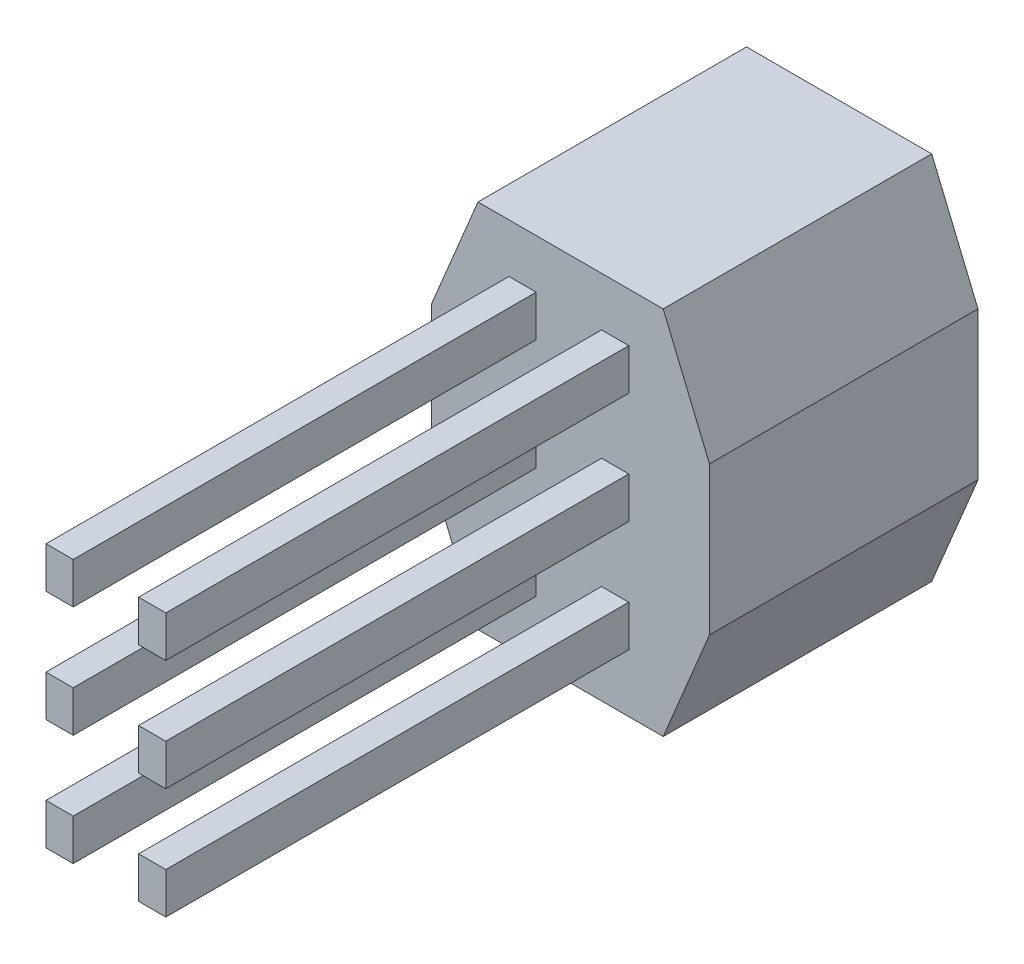
ISO-10303-21;
HEADER;
FILE_DESCRIPTION(('STEP AP214'),'2;1');
FILE_NAME('part.step','',(''),(''),'','','');
FILE_SCHEMA(('AUTOMOTIVE_DESIGN { 1 0 10303 214 1 1 1 1 }'));
ENDSEC;
DATA;
#1=APPLICATION_CONTEXT('core data for automotive mechanical design processes');
#2=APPLICATION_PROTOCOL_DEFINITION('international standard','automotive_design',2000,#1);
#3=PRODUCT_CONTEXT('',#1,'mechanical');
#4=PRODUCT('Part','Part','',(#3));
#5=PRODUCT_RELATED_PRODUCT_CATEGORY('part','',(#4));
#6=PRODUCT_DEFINITION_FORMATION('','',#4);
#7=PRODUCT_DEFINITION_CONTEXT('part definition',#1,'design');
#8=PRODUCT_DEFINITION('design','',#6,#7);
#9=PRODUCT_DEFINITION_SHAPE('','',#8);
#10=(LENGTH_UNIT() NAMED_UNIT(*) SI_UNIT(.MILLI.,.METRE.));
#11=(NAMED_UNIT(*) PLANE_ANGLE_UNIT() SI_UNIT($,.RADIAN.));
#12=(NAMED_UNIT(*) SI_UNIT($,.STERADIAN.) SOLID_ANGLE_UNIT());
#13=UNCERTAINTY_MEASURE_WITH_UNIT(LENGTH_MEASURE(1.E-05),#10,'distance_accuracy_value','');
#14=(GEOMETRIC_REPRESENTATION_CONTEXT(3) GLOBAL_UNCERTAINTY_ASSIGNED_CONTEXT((#13)) GLOBAL_UNIT_ASSIGNED_CONTEXT((#10,
#11,#12)) REPRESENTATION_CONTEXT('',''));
#15=CARTESIAN_POINT('',(0.,0.,0.));
#16=DIRECTION('',(0.,0.,1.));
#17=DIRECTION('',(1.,0.,0.));
#18=AXIS2_PLACEMENT_3D('',#15,#16,#17);
#19=CARTESIAN_POINT('',(0.,0.,2.9));
#20=DIRECTION('',(0.,0.,-1.));
#21=DIRECTION('',(-1.,0.,0.));
#22=AXIS2_PLACEMENT_3D('',#19,#20,#21);
#23=PLANE('',#22);
#24=DIRECTION('',(-1.,0.,0.));
#25=VECTOR('',#24,1.);
#26=CARTESIAN_POINT('',(-391.980357623965,89.1908328465635,2.9));
#27=LINE('',#26,#25);
#28=CARTESIAN_POINT('',(-391.686463136409,89.1908328465635,2.9));
#29=VERTEX_POINT('',#28);
#30=CARTESIAN_POINT('',(-391.980357623965,89.1908328465635,2.9));
#31=VERTEX_POINT('',#30);
#32=EDGE_CURVE('E262',#29,#31,#27,.T.);
#33=ORIENTED_EDGE('',*,*,#32,.F.);
#34=DIRECTION('',(0.,1.,0.));
#35=VECTOR('',#34,1.);
#36=CARTESIAN_POINT('',(-391.686463136409,89.1908328465635,2.9));
#37=LINE('',#36,#35);
#38=CARTESIAN_POINT('',(-391.686463136409,88.7462232371862,2.9));
#39=VERTEX_POINT('',#38);
#40=EDGE_CURVE('E275',#39,#29,#37,.T.);
#41=ORIENTED_EDGE('',*,*,#40,.F.);
#42=DIRECTION('',(1.,0.,0.));
#43=VECTOR('',#42,1.);
#44=CARTESIAN_POINT('',(-391.980357623965,88.7462232371862,2.9));
#45=LINE('',#44,#43);
#46=CARTESIAN_POINT('',(-391.980357623965,88.7462232371862,2.9));
#47=VERTEX_POINT('',#46);
#48=EDGE_CURVE('E284',#47,#39,#45,.T.);
#49=ORIENTED_EDGE('',*,*,#48,.F.);
#50=DIRECTION('',(0.,-1.,0.));
#51=VECTOR('',#50,1.);
#52=CARTESIAN_POINT('',(-391.980357623965,89.1908328465635,2.9));
#53=LINE('',#52,#51);
#54=EDGE_CURVE('E265',#31,#47,#53,.T.);
#55=ORIENTED_EDGE('',*,*,#54,.F.);
#56=EDGE_LOOP('',(#33,#41,#49,#55));
#57=FACE_BOUND('',#56,.T.);
#58=DIRECTION('',(-1.,0.,0.));
#59=VECTOR('',#58,1.);
#60=CARTESIAN_POINT('',(-390.980357623965,89.1908328465635,2.9));
#61=LINE('',#60,#59);
#62=CARTESIAN_POINT('',(-390.686463136409,89.1908328465635,2.9));
#63=VERTEX_POINT('',#62);
#64=CARTESIAN_POINT('',(-390.980357623965,89.1908328465635,2.9));
#65=VERTEX_POINT('',#64);
#66=EDGE_CURVE('E333',#63,#65,#61,.T.);
#67=ORIENTED_EDGE('',*,*,#66,.F.);
#68=DIRECTION('',(0.,1.,0.));
#69=VECTOR('',#68,1.);
#70=CARTESIAN_POINT('',(-390.686463136409,89.1908328465635,2.9));
#71=LINE('',#70,#69);
#72=CARTESIAN_POINT('',(-390.686463136409,88.7462232371862,2.9));
#73=VERTEX_POINT('',#72);
#74=EDGE_CURVE('E338',#73,#63,#71,.T.);
#75=ORIENTED_EDGE('',*,*,#74,.F.);
#76=DIRECTION('',(1.,0.,0.));
#77=VECTOR('',#76,1.);
#78=CARTESIAN_POINT('',(-390.980357623965,88.7462232371862,2.9));
#79=LINE('',#78,#77);
#80=CARTESIAN_POINT('',(-390.980357623965,88.7462232371862,2.9));
#81=VERTEX_POINT('',#80);
#82=EDGE_CURVE('E350',#81,#73,#79,.T.);
#83=ORIENTED_EDGE('',*,*,#82,.F.);
#84=DIRECTION('',(0.,-1.,0.));
#85=VECTOR('',#84,1.);
#86=CARTESIAN_POINT('',(-390.980357623965,89.1908328465635,2.9));
#87=LINE('',#86,#85);
#88=EDGE_CURVE('E347',#65,#81,#87,.T.);
#89=ORIENTED_EDGE('',*,*,#88,.F.);
#90=EDGE_LOOP('',(#67,#75,#83,#89));
#91=FACE_BOUND('',#90,.T.);
#92=DIRECTION('',(0.,-1.,0.));
#93=VECTOR('',#92,1.);
#94=CARTESIAN_POINT('',(-391.980357623965,90.3908328465635,2.9));
#95=LINE('',#94,#93);
#96=CARTESIAN_POINT('',(-391.980357623965,90.3908328465635,2.9));
#97=VERTEX_POINT('',#96);
#98=CARTESIAN_POINT('',(-391.980357623965,89.9462232371862,2.9));
#99=VERTEX_POINT('',#98);
#100=EDGE_CURVE('E399',#97,#99,#95,.T.);
#101=ORIENTED_EDGE('',*,*,#100,.F.);
#102=DIRECTION('',(-1.,0.,0.));
#103=VECTOR('',#102,1.);
#104=CARTESIAN_POINT('',(-391.980357623965,90.3908328465635,2.9));
#105=LINE('',#104,#103);
#106=CARTESIAN_POINT('',(-391.686463136409,90.3908328465635,2.9));
#107=VERTEX_POINT('',#106);
#108=EDGE_CURVE('E404',#107,#97,#105,.T.);
#109=ORIENTED_EDGE('',*,*,#108,.F.);
#110=DIRECTION('',(0.,1.,0.));
#111=VECTOR('',#110,1.);
#112=CARTESIAN_POINT('',(-391.686463136409,90.3908328465635,2.9));
#113=LINE('',#112,#111);
#114=CARTESIAN_POINT('',(-391.686463136409,89.9462232371862,2.9));
#115=VERTEX_POINT('',#114);
#116=EDGE_CURVE('E416',#115,#107,#113,.T.);
#117=ORIENTED_EDGE('',*,*,#116,.F.);
#118=DIRECTION('',(1.,0.,0.));
#119=VECTOR('',#118,1.);
#120=CARTESIAN_POINT('',(-391.980357623965,89.9462232371862,2.9));
#121=LINE('',#120,#119);
#122=EDGE_CURVE('E413',#99,#115,#121,.T.);
#123=ORIENTED_EDGE('',*,*,#122,.F.);
#124=EDGE_LOOP('',(#101,#109,#117,#123));
#125=FACE_BOUND('',#124,.T.);
#126=DIRECTION('',(-1.,0.,0.));
#127=VECTOR('',#126,1.);
#128=CARTESIAN_POINT('',(-392.31475321784,90.9205874968529,2.9));
#129=LINE('',#128,#127);
#130=CARTESIAN_POINT('',(-390.31475321784,90.9205874968529,2.9));
#131=VERTEX_POINT('',#130);
#132=CARTESIAN_POINT('',(-392.31475321784,90.9205874968529,2.9));
#133=VERTEX_POINT('',#132);
#134=EDGE_CURVE('E433',#131,#133,#129,.T.);
#135=ORIENTED_EDGE('',*,*,#134,.T.);
#136=DIRECTION('',(-0.384615384615383,-0.923076923076924,0.));
#137=VECTOR('',#136,1.);
#138=CARTESIAN_POINT('',(-392.81475321784,89.7205874968529,2.9));
#139=LINE('',#138,#137);
#140=CARTESIAN_POINT('',(-392.81475321784,89.7205874968529,2.9));
#141=VERTEX_POINT('',#140);
#142=EDGE_CURVE('E436',#133,#141,#139,.T.);
#143=ORIENTED_EDGE('',*,*,#142,.T.);
#144=DIRECTION('',(0.,-1.,0.));
#145=VECTOR('',#144,1.);
#146=CARTESIAN_POINT('',(-392.81475321784,89.7205874968529,2.9));
#147=LINE('',#146,#145);
#148=CARTESIAN_POINT('',(-392.81475321784,88.1205874968529,2.9));
#149=VERTEX_POINT('',#148);
#150=EDGE_CURVE('E439',#141,#149,#147,.T.);
#151=ORIENTED_EDGE('',*,*,#150,.T.);
#152=DIRECTION('',(0.384615384615383,-0.923076923076924,0.));
#153=VECTOR('',#152,1.);
#154=CARTESIAN_POINT('',(-392.81475321784,88.1205874968529,2.9));
#155=LINE('',#154,#153);
#156=CARTESIAN_POINT('',(-392.31475321784,86.9205874968529,2.9));
#157=VERTEX_POINT('',#156);
#158=EDGE_CURVE('E441',#149,#157,#155,.T.);
#159=ORIENTED_EDGE('',*,*,#158,.T.);
#160=DIRECTION('',(1.,0.,0.));
#161=VECTOR('',#160,1.);
#162=CARTESIAN_POINT('',(-392.31475321784,86.9205874968529,2.9));
#163=LINE('',#162,#161);
#164=CARTESIAN_POINT('',(-390.31475321784,86.9205874968529,2.9));
#165=VERTEX_POINT('',#164);
#166=EDGE_CURVE('E443',#157,#165,#163,.T.);
#167=ORIENTED_EDGE('',*,*,#166,.T.);
#168=DIRECTION('',(0.384615384615383,0.923076923076924,0.));
#169=VECTOR('',#168,1.);
#170=CARTESIAN_POINT('',(-389.81475321784,88.1205874968529,2.9));
#171=LINE('',#170,#169);
#172=CARTESIAN_POINT('',(-389.81475321784,88.1205874968529,2.9));
#173=VERTEX_POINT('',#172);
#174=EDGE_CURVE('E445',#165,#173,#171,.T.);
#175=ORIENTED_EDGE('',*,*,#174,.T.);
#176=DIRECTION('',(0.,1.,0.));
#177=VECTOR('',#176,1.);
#178=CARTESIAN_POINT('',(-389.81475321784,89.7205874968529,2.9));
#179=LINE('',#178,#177);
#180=CARTESIAN_POINT('',(-389.81475321784,89.7205874968529,2.9));
#181=VERTEX_POINT('',#180);
#182=EDGE_CURVE('E447',#173,#181,#179,.T.);
#183=ORIENTED_EDGE('',*,*,#182,.T.);
#184=DIRECTION('',(-0.384615384615383,0.923076923076924,0.));
#185=VECTOR('',#184,1.);
#186=CARTESIAN_POINT('',(-389.81475321784,89.7205874968529,2.9));
#187=LINE('',#186,#185);
#188=EDGE_CURVE('E449',#181,#131,#187,.T.);
#189=ORIENTED_EDGE('',*,*,#188,.T.);
#190=EDGE_LOOP('',(#135,#143,#151,#159,#167,#175,#183,#189));
#191=FACE_BOUND('',#190,.T.);
#192=DIRECTION('',(-1.,0.,0.));
#193=VECTOR('',#192,1.);
#194=CARTESIAN_POINT('',(-390.980357623965,90.3908328465635,2.9));
#195=LINE('',#194,#193);
#196=CARTESIAN_POINT('',(-390.686463136409,90.3908328465635,2.9));
#197=VERTEX_POINT('',#196);
#198=CARTESIAN_POINT('',(-390.980357623965,90.3908328465635,2.9));
#199=VERTEX_POINT('',#198);
#200=EDGE_CURVE('E366',#197,#199,#195,.T.);
#201=ORIENTED_EDGE('',*,*,#200,.F.);
#202=DIRECTION('',(0.,1.,0.));
#203=VECTOR('',#202,1.);
#204=CARTESIAN_POINT('',(-390.686463136409,90.3908328465635,2.9));
#205=LINE('',#204,#203);
#206=CARTESIAN_POINT('',(-390.686463136409,89.9462232371862,2.9));
#207=VERTEX_POINT('',#206);
#208=EDGE_CURVE('E371',#207,#197,#205,.T.);
#209=ORIENTED_EDGE('',*,*,#208,.F.);
#210=DIRECTION('',(1.,0.,0.));
#211=VECTOR('',#210,1.);
#212=CARTESIAN_POINT('',(-390.980357623965,89.9462232371862,2.9));
#213=LINE('',#212,#211);
#214=CARTESIAN_POINT('',(-390.980357623965,89.9462232371862,2.9));
#215=VERTEX_POINT('',#214);
#216=EDGE_CURVE('E383',#215,#207,#213,.T.);
#217=ORIENTED_EDGE('',*,*,#216,.F.);
#218=DIRECTION('',(0.,-1.,0.));
#219=VECTOR('',#218,1.);
#220=CARTESIAN_POINT('',(-390.980357623965,90.3908328465635,2.9));
#221=LINE('',#220,#219);
#222=EDGE_CURVE('E380',#199,#215,#221,.T.);
#223=ORIENTED_EDGE('',*,*,#222,.F.);
#224=EDGE_LOOP('',(#201,#209,#217,#223));
#225=FACE_BOUND('',#224,.T.);
#226=DIRECTION('',(-1.,0.,0.));
#227=VECTOR('',#226,1.);
#228=CARTESIAN_POINT('',(-390.980357623965,87.9908328465635,2.9));
#229=LINE('',#228,#227);
#230=CARTESIAN_POINT('',(-390.686463136409,87.9908328465635,2.9));
#231=VERTEX_POINT('',#230);
#232=CARTESIAN_POINT('',(-390.980357623965,87.9908328465635,2.9));
#233=VERTEX_POINT('',#232);
#234=EDGE_CURVE('E300',#231,#233,#229,.T.);
#235=ORIENTED_EDGE('',*,*,#234,.F.);
#236=DIRECTION('',(0.,1.,0.));
#237=VECTOR('',#236,1.);
#238=CARTESIAN_POINT('',(-390.686463136409,87.9908328465635,2.9));
#239=LINE('',#238,#237);
#240=CARTESIAN_POINT('',(-390.686463136409,87.5462232371862,2.9));
#241=VERTEX_POINT('',#240);
#242=EDGE_CURVE('E305',#241,#231,#239,.T.);
#243=ORIENTED_EDGE('',*,*,#242,.F.);
#244=DIRECTION('',(1.,0.,0.));
#245=VECTOR('',#244,1.);
#246=CARTESIAN_POINT('',(-390.980357623965,87.5462232371862,2.9));
#247=LINE('',#246,#245);
#248=CARTESIAN_POINT('',(-390.980357623965,87.5462232371862,2.9));
#249=VERTEX_POINT('',#248);
#250=EDGE_CURVE('E317',#249,#241,#247,.T.);
#251=ORIENTED_EDGE('',*,*,#250,.F.);
#252=DIRECTION('',(0.,-1.,0.));
#253=VECTOR('',#252,1.);
#254=CARTESIAN_POINT('',(-390.980357623965,87.9908328465635,2.9));
#255=LINE('',#254,#253);
#256=EDGE_CURVE('E314',#233,#249,#255,.T.);
#257=ORIENTED_EDGE('',*,*,#256,.F.);
#258=EDGE_LOOP('',(#235,#243,#251,#257));
#259=FACE_BOUND('',#258,.T.);
#260=DIRECTION('',(-1.,0.,0.));
#261=VECTOR('',#260,1.);
#262=CARTESIAN_POINT('',(-391.980357623965,87.9908328465635,2.9));
#263=LINE('',#262,#261);
#264=CARTESIAN_POINT('',(-391.686463136409,87.9908328465635,2.9));
#265=VERTEX_POINT('',#264);
#266=CARTESIAN_POINT('',(-391.980357623965,87.9908328465635,2.9));
#267=VERTEX_POINT('',#266);
#268=EDGE_CURVE('E261',#265,#267,#263,.T.);
#269=ORIENTED_EDGE('',*,*,#268,.F.);
#270=DIRECTION('',(0.,1.,0.));
#271=VECTOR('',#270,1.);
#272=CARTESIAN_POINT('',(-391.686463136409,87.9908328465635,2.9));
#273=LINE('',#272,#271);
#274=CARTESIAN_POINT('',(-391.686463136409,87.5462232371862,2.9));
#275=VERTEX_POINT('',#274);
#276=EDGE_CURVE('E258',#275,#265,#273,.T.);
#277=ORIENTED_EDGE('',*,*,#276,.F.);
#278=DIRECTION('',(1.,0.,0.));
#279=VECTOR('',#278,1.);
#280=CARTESIAN_POINT('',(-391.980357623965,87.5462232371862,2.9));
#281=LINE('',#280,#279);
#282=CARTESIAN_POINT('',(-391.980357623965,87.5462232371862,2.9));
#283=VERTEX_POINT('',#282);
#284=EDGE_CURVE('E52',#283,#275,#281,.T.);
#285=ORIENTED_EDGE('',*,*,#284,.F.);
#286=DIRECTION('',(0.,-1.,0.));
#287=VECTOR('',#286,1.);
#288=CARTESIAN_POINT('',(-391.980357623965,87.9908328465635,2.9));
#289=LINE('',#288,#287);
#290=EDGE_CURVE('E47',#267,#283,#289,.T.);
#291=ORIENTED_EDGE('',*,*,#290,.F.);
#292=EDGE_LOOP('',(#269,#277,#285,#291));
#293=FACE_BOUND('',#292,.T.);
#294=ADVANCED_FACE('F32',(#57,#91,#125,#191,#225,#259,#293),#23,.F.);
#295=CARTESIAN_POINT('',(-392.31475321784,90.9205874968529,2.9));
#296=DIRECTION('',(0.,-1.,0.));
#297=DIRECTION('',(0.,0.,-1.));
#298=AXIS2_PLACEMENT_3D('',#295,#296,#297);
#299=PLANE('',#298);
#300=DIRECTION('',(-1.,0.,0.));
#301=VECTOR('',#300,1.);
#302=CARTESIAN_POINT('',(-392.31475321784,90.9205874968529,0.));
#303=LINE('',#302,#301);
#304=CARTESIAN_POINT('',(-390.31475321784,90.9205874968529,0.));
#305=VERTEX_POINT('',#304);
#306=CARTESIAN_POINT('',(-392.31475321784,90.9205874968529,0.));
#307=VERTEX_POINT('',#306);
#308=EDGE_CURVE('E432',#305,#307,#303,.T.);
#309=ORIENTED_EDGE('',*,*,#308,.T.);
#310=DIRECTION('',(0.,0.,-1.));
#311=VECTOR('',#310,1.);
#312=CARTESIAN_POINT('',(-392.31475321784,90.9205874968529,2.9));
#313=LINE('',#312,#311);
#314=EDGE_CURVE('E11',#133,#307,#313,.T.);
#315=ORIENTED_EDGE('',*,*,#314,.F.);
#316=ORIENTED_EDGE('',*,*,#134,.F.);
#317=DIRECTION('',(0.,0.,-1.));
#318=VECTOR('',#317,1.);
#319=CARTESIAN_POINT('',(-390.31475321784,90.9205874968529,2.9));
#320=LINE('',#319,#318);
#321=EDGE_CURVE('E451',#131,#305,#320,.T.);
#322=ORIENTED_EDGE('',*,*,#321,.T.);
#323=EDGE_LOOP('',(#309,#315,#316,#322));
#324=FACE_BOUND('',#323,.T.);
#325=ADVANCED_FACE('F34',(#324),#299,.F.);
#326=CARTESIAN_POINT('',(-392.81475321784,89.7205874968529,2.9));
#327=DIRECTION('',(0.923076923076924,-0.384615384615383,0.));
#328=DIRECTION('',(0.384615384615383,0.923076923076924,0.));
#329=AXIS2_PLACEMENT_3D('',#326,#327,#328);
#330=PLANE('',#329);
#331=DIRECTION('',(-0.384615384615383,-0.923076923076924,0.));
#332=VECTOR('',#331,1.);
#333=CARTESIAN_POINT('',(-392.81475321784,89.7205874968529,0.));
#334=LINE('',#333,#332);
#335=CARTESIAN_POINT('',(-392.81475321784,89.7205874968529,0.));
#336=VERTEX_POINT('',#335);
#337=EDGE_CURVE('E454',#307,#336,#334,.T.);
#338=ORIENTED_EDGE('',*,*,#337,.T.);
#339=DIRECTION('',(0.,0.,-1.));
#340=VECTOR('',#339,1.);
#341=CARTESIAN_POINT('',(-392.81475321784,89.7205874968529,2.9));
#342=LINE('',#341,#340);
#343=EDGE_CURVE('E40',#141,#336,#342,.T.);
#344=ORIENTED_EDGE('',*,*,#343,.F.);
#345=ORIENTED_EDGE('',*,*,#142,.F.);
#346=ORIENTED_EDGE('',*,*,#314,.T.);
#347=EDGE_LOOP('',(#338,#344,#345,#346));
#348=FACE_BOUND('',#347,.T.);
#349=ADVANCED_FACE('F511',(#348),#330,.F.);
#350=CARTESIAN_POINT('',(-392.81475321784,89.7205874968529,2.9));
#351=DIRECTION('',(1.,0.,0.));
#352=DIRECTION('',(0.,0.,-1.));
#353=AXIS2_PLACEMENT_3D('',#350,#351,#352);
#354=PLANE('',#353);
#355=DIRECTION('',(0.,-1.,0.));
#356=VECTOR('',#355,1.);
#357=CARTESIAN_POINT('',(-392.81475321784,89.7205874968529,0.));
#358=LINE('',#357,#356);
#359=CARTESIAN_POINT('',(-392.81475321784,88.1205874968529,0.));
#360=VERTEX_POINT('',#359);
#361=EDGE_CURVE('E456',#336,#360,#358,.T.);
#362=ORIENTED_EDGE('',*,*,#361,.T.);
#363=DIRECTION('',(0.,0.,-1.));
#364=VECTOR('',#363,1.);
#365=CARTESIAN_POINT('',(-392.81475321784,88.1205874968529,2.9));
#366=LINE('',#365,#364);
#367=EDGE_CURVE('E481',#149,#360,#366,.T.);
#368=ORIENTED_EDGE('',*,*,#367,.F.);
#369=ORIENTED_EDGE('',*,*,#150,.F.);
#370=ORIENTED_EDGE('',*,*,#343,.T.);
#371=EDGE_LOOP('',(#362,#368,#369,#370));
#372=FACE_BOUND('',#371,.T.);
#373=ADVANCED_FACE('F488',(#372),#354,.F.);
#374=CARTESIAN_POINT('',(-392.81475321784,88.1205874968529,2.9));
#375=DIRECTION('',(0.923076923076924,0.384615384615383,0.));
#376=DIRECTION('',(-0.384615384615383,0.923076923076924,0.));
#377=AXIS2_PLACEMENT_3D('',#374,#375,#376);
#378=PLANE('',#377);
#379=DIRECTION('',(0.384615384615383,-0.923076923076924,0.));
#380=VECTOR('',#379,1.);
#381=CARTESIAN_POINT('',(-392.81475321784,88.1205874968529,0.));
#382=LINE('',#381,#380);
#383=CARTESIAN_POINT('',(-392.31475321784,86.9205874968529,0.));
#384=VERTEX_POINT('',#383);
#385=EDGE_CURVE('E458',#360,#384,#382,.T.);
#386=ORIENTED_EDGE('',*,*,#385,.T.);
#387=DIRECTION('',(0.,0.,-1.));
#388=VECTOR('',#387,1.);
#389=CARTESIAN_POINT('',(-392.31475321784,86.9205874968529,2.9));
#390=LINE('',#389,#388);
#391=EDGE_CURVE('E478',#157,#384,#390,.T.);
#392=ORIENTED_EDGE('',*,*,#391,.F.);
#393=ORIENTED_EDGE('',*,*,#158,.F.);
#394=ORIENTED_EDGE('',*,*,#367,.T.);
#395=EDGE_LOOP('',(#386,#392,#393,#394));
#396=FACE_BOUND('',#395,.T.);
#397=ADVANCED_FACE('F499',(#396),#378,.F.);
#398=CARTESIAN_POINT('',(-392.31475321784,86.9205874968529,2.9));
#399=DIRECTION('',(0.,1.,0.));
#400=DIRECTION('',(0.,0.,1.));
#401=AXIS2_PLACEMENT_3D('',#398,#399,#400);
#402=PLANE('',#401);
#403=DIRECTION('',(1.,0.,0.));
#404=VECTOR('',#403,1.);
#405=CARTESIAN_POINT('',(-392.31475321784,86.9205874968529,0.));
#406=LINE('',#405,#404);
#407=CARTESIAN_POINT('',(-390.31475321784,86.9205874968529,0.));
#408=VERTEX_POINT('',#407);
#409=EDGE_CURVE('E460',#384,#408,#406,.T.);
#410=ORIENTED_EDGE('',*,*,#409,.T.);
#411=DIRECTION('',(0.,0.,-1.));
#412=VECTOR('',#411,1.);
#413=CARTESIAN_POINT('',(-390.31475321784,86.9205874968529,2.9));
#414=LINE('',#413,#412);
#415=EDGE_CURVE('E475',#165,#408,#414,.T.);
#416=ORIENTED_EDGE('',*,*,#415,.F.);
#417=ORIENTED_EDGE('',*,*,#166,.F.);
#418=ORIENTED_EDGE('',*,*,#391,.T.);
#419=EDGE_LOOP('',(#410,#416,#417,#418));
#420=FACE_BOUND('',#419,.T.);
#421=ADVANCED_FACE('F503',(#420),#402,.F.);
#422=CARTESIAN_POINT('',(-389.81475321784,88.1205874968529,2.9));
#423=DIRECTION('',(-0.923076923076924,0.384615384615383,0.));
#424=DIRECTION('',(-0.384615384615383,-0.923076923076924,0.));
#425=AXIS2_PLACEMENT_3D('',#422,#423,#424);
#426=PLANE('',#425);
#427=DIRECTION('',(0.384615384615383,0.923076923076924,0.));
#428=VECTOR('',#427,1.);
#429=CARTESIAN_POINT('',(-389.81475321784,88.1205874968529,0.));
#430=LINE('',#429,#428);
#431=CARTESIAN_POINT('',(-389.81475321784,88.1205874968529,0.));
#432=VERTEX_POINT('',#431);
#433=EDGE_CURVE('E462',#408,#432,#430,.T.);
#434=ORIENTED_EDGE('',*,*,#433,.T.);
#435=DIRECTION('',(0.,0.,-1.));
#436=VECTOR('',#435,1.);
#437=CARTESIAN_POINT('',(-389.81475321784,88.1205874968529,2.9));
#438=LINE('',#437,#436);
#439=EDGE_CURVE('E472',#173,#432,#438,.T.);
#440=ORIENTED_EDGE('',*,*,#439,.F.);
#441=ORIENTED_EDGE('',*,*,#174,.F.);
#442=ORIENTED_EDGE('',*,*,#415,.T.);
#443=EDGE_LOOP('',(#434,#440,#441,#442));
#444=FACE_BOUND('',#443,.T.);
#445=ADVANCED_FACE('F524',(#444),#426,.F.);
#446=CARTESIAN_POINT('',(-389.81475321784,89.7205874968529,2.9));
#447=DIRECTION('',(-1.,0.,0.));
#448=DIRECTION('',(0.,0.,1.));
#449=AXIS2_PLACEMENT_3D('',#446,#447,#448);
#450=PLANE('',#449);
#451=DIRECTION('',(0.,1.,0.));
#452=VECTOR('',#451,1.);
#453=CARTESIAN_POINT('',(-389.81475321784,89.7205874968529,0.));
#454=LINE('',#453,#452);
#455=CARTESIAN_POINT('',(-389.81475321784,89.7205874968529,0.));
#456=VERTEX_POINT('',#455);
#457=EDGE_CURVE('E464',#432,#456,#454,.T.);
#458=ORIENTED_EDGE('',*,*,#457,.T.);
#459=DIRECTION('',(0.,0.,-1.));
#460=VECTOR('',#459,1.);
#461=CARTESIAN_POINT('',(-389.81475321784,89.7205874968529,2.9));
#462=LINE('',#461,#460);
#463=EDGE_CURVE('E469',#181,#456,#462,.T.);
#464=ORIENTED_EDGE('',*,*,#463,.F.);
#465=ORIENTED_EDGE('',*,*,#182,.F.);
#466=ORIENTED_EDGE('',*,*,#439,.T.);
#467=EDGE_LOOP('',(#458,#464,#465,#466));
#468=FACE_BOUND('',#467,.T.);
#469=ADVANCED_FACE('F522',(#468),#450,.F.);
#470=CARTESIAN_POINT('',(-389.81475321784,89.7205874968529,2.9));
#471=DIRECTION('',(-0.923076923076924,-0.384615384615383,0.));
#472=DIRECTION('',(0.384615384615383,-0.923076923076924,0.));
#473=AXIS2_PLACEMENT_3D('',#470,#471,#472);
#474=PLANE('',#473);
#475=DIRECTION('',(-0.384615384615383,0.923076923076924,0.));
#476=VECTOR('',#475,1.);
#477=CARTESIAN_POINT('',(-389.81475321784,89.7205874968529,0.));
#478=LINE('',#477,#476);
#479=EDGE_CURVE('E437',#456,#305,#478,.T.);
#480=ORIENTED_EDGE('',*,*,#479,.T.);
#481=ORIENTED_EDGE('',*,*,#321,.F.);
#482=ORIENTED_EDGE('',*,*,#188,.F.);
#483=ORIENTED_EDGE('',*,*,#463,.T.);
#484=EDGE_LOOP('',(#480,#481,#482,#483));
#485=FACE_BOUND('',#484,.T.);
#486=ADVANCED_FACE('F517',(#485),#474,.F.);
#487=CARTESIAN_POINT('',(0.,0.,0.));
#488=DIRECTION('',(0.,0.,-1.));
#489=DIRECTION('',(-1.,0.,0.));
#490=AXIS2_PLACEMENT_3D('',#487,#488,#489);
#491=PLANE('',#490);
#492=ORIENTED_EDGE('',*,*,#308,.F.);
#493=ORIENTED_EDGE('',*,*,#479,.F.);
#494=ORIENTED_EDGE('',*,*,#457,.F.);
#495=ORIENTED_EDGE('',*,*,#433,.F.);
#496=ORIENTED_EDGE('',*,*,#409,.F.);
#497=ORIENTED_EDGE('',*,*,#385,.F.);
#498=ORIENTED_EDGE('',*,*,#361,.F.);
#499=ORIENTED_EDGE('',*,*,#337,.F.);
#500=EDGE_LOOP('',(#492,#493,#494,#495,#496,#497,#498,#499));
#501=FACE_BOUND('',#500,.T.);
#502=ADVANCED_FACE('F494',(#501),#491,.T.);
#503=CARTESIAN_POINT('',(-391.980357623965,90.3908328465635,7.9));
#504=DIRECTION('',(1.,0.,0.));
#505=DIRECTION('',(0.,0.,-1.));
#506=AXIS2_PLACEMENT_3D('',#503,#504,#505);
#507=PLANE('',#506);
#508=ORIENTED_EDGE('',*,*,#100,.T.);
#509=DIRECTION('',(0.,0.,-1.));
#510=VECTOR('',#509,1.);
#511=CARTESIAN_POINT('',(-391.980357623965,89.9462232371862,7.9));
#512=LINE('',#511,#510);
#513=CARTESIAN_POINT('',(-391.980357623965,89.9462232371862,7.9));
#514=VERTEX_POINT('',#513);
#515=EDGE_CURVE('E429',#514,#99,#512,.T.);
#516=ORIENTED_EDGE('',*,*,#515,.F.);
#517=DIRECTION('',(0.,-1.,0.));
#518=VECTOR('',#517,1.);
#519=CARTESIAN_POINT('',(-391.980357623965,90.3908328465635,7.9));
#520=LINE('',#519,#518);
#521=CARTESIAN_POINT('',(-391.980357623965,90.3908328465635,7.9));
#522=VERTEX_POINT('',#521);
#523=EDGE_CURVE('E400',#522,#514,#520,.T.);
#524=ORIENTED_EDGE('',*,*,#523,.F.);
#525=DIRECTION('',(0.,0.,-1.));
#526=VECTOR('',#525,1.);
#527=CARTESIAN_POINT('',(-391.980357623965,90.3908328465635,7.9));
#528=LINE('',#527,#526);
#529=EDGE_CURVE('E410',#522,#97,#528,.T.);
#530=ORIENTED_EDGE('',*,*,#529,.T.);
#531=EDGE_LOOP('',(#508,#516,#524,#530));
#532=FACE_BOUND('',#531,.T.);
#533=ADVANCED_FACE('F542',(#532),#507,.F.);
#534=CARTESIAN_POINT('',(-391.980357623965,89.9462232371862,7.9));
#535=DIRECTION('',(0.,1.,0.));
#536=DIRECTION('',(0.,0.,1.));
#537=AXIS2_PLACEMENT_3D('',#534,#535,#536);
#538=PLANE('',#537);
#539=ORIENTED_EDGE('',*,*,#122,.T.);
#540=DIRECTION('',(0.,0.,-1.));
#541=VECTOR('',#540,1.);
#542=CARTESIAN_POINT('',(-391.686463136409,89.9462232371862,7.9));
#543=LINE('',#542,#541);
#544=CARTESIAN_POINT('',(-391.686463136409,89.9462232371862,7.9));
#545=VERTEX_POINT('',#544);
#546=EDGE_CURVE('E426',#545,#115,#543,.T.);
#547=ORIENTED_EDGE('',*,*,#546,.F.);
#548=DIRECTION('',(1.,0.,0.));
#549=VECTOR('',#548,1.);
#550=CARTESIAN_POINT('',(-391.980357623965,89.9462232371862,7.9));
#551=LINE('',#550,#549);
#552=EDGE_CURVE('E403',#514,#545,#551,.T.);
#553=ORIENTED_EDGE('',*,*,#552,.F.);
#554=ORIENTED_EDGE('',*,*,#515,.T.);
#555=EDGE_LOOP('',(#539,#547,#553,#554));
#556=FACE_BOUND('',#555,.T.);
#557=ADVANCED_FACE('F561',(#556),#538,.F.);
#558=CARTESIAN_POINT('',(-391.686463136409,90.3908328465635,7.9));
#559=DIRECTION('',(-1.,0.,0.));
#560=DIRECTION('',(0.,0.,1.));
#561=AXIS2_PLACEMENT_3D('',#558,#559,#560);
#562=PLANE('',#561);
#563=ORIENTED_EDGE('',*,*,#116,.T.);
#564=DIRECTION('',(0.,0.,-1.));
#565=VECTOR('',#564,1.);
#566=CARTESIAN_POINT('',(-391.686463136409,90.3908328465635,7.9));
#567=LINE('',#566,#565);
#568=CARTESIAN_POINT('',(-391.686463136409,90.3908328465635,7.9));
#569=VERTEX_POINT('',#568);
#570=EDGE_CURVE('E423',#569,#107,#567,.T.);
#571=ORIENTED_EDGE('',*,*,#570,.F.);
#572=DIRECTION('',(0.,1.,0.));
#573=VECTOR('',#572,1.);
#574=CARTESIAN_POINT('',(-391.686463136409,90.3908328465635,7.9));
#575=LINE('',#574,#573);
#576=EDGE_CURVE('E406',#545,#569,#575,.T.);
#577=ORIENTED_EDGE('',*,*,#576,.F.);
#578=ORIENTED_EDGE('',*,*,#546,.T.);
#579=EDGE_LOOP('',(#563,#571,#577,#578));
#580=FACE_BOUND('',#579,.T.);
#581=ADVANCED_FACE('F568',(#580),#562,.F.);
#582=CARTESIAN_POINT('',(-391.980357623965,90.3908328465635,7.9));
#583=DIRECTION('',(0.,-1.,0.));
#584=DIRECTION('',(0.,0.,-1.));
#585=AXIS2_PLACEMENT_3D('',#582,#583,#584);
#586=PLANE('',#585);
#587=ORIENTED_EDGE('',*,*,#108,.T.);
#588=ORIENTED_EDGE('',*,*,#529,.F.);
#589=DIRECTION('',(-1.,0.,0.));
#590=VECTOR('',#589,1.);
#591=CARTESIAN_POINT('',(-391.980357623965,90.3908328465635,7.9));
#592=LINE('',#591,#590);
#593=EDGE_CURVE('E408',#569,#522,#592,.T.);
#594=ORIENTED_EDGE('',*,*,#593,.F.);
#595=ORIENTED_EDGE('',*,*,#570,.T.);
#596=EDGE_LOOP('',(#587,#588,#594,#595));
#597=FACE_BOUND('',#596,.T.);
#598=ADVANCED_FACE('F575',(#597),#586,.F.);
#599=CARTESIAN_POINT('',(0.,0.,7.9));
#600=DIRECTION('',(0.,0.,1.));
#601=DIRECTION('',(1.,0.,0.));
#602=AXIS2_PLACEMENT_3D('',#599,#600,#601);
#603=PLANE('',#602);
#604=ORIENTED_EDGE('',*,*,#523,.T.);
#605=ORIENTED_EDGE('',*,*,#552,.T.);
#606=ORIENTED_EDGE('',*,*,#576,.T.);
#607=ORIENTED_EDGE('',*,*,#593,.T.);
#608=EDGE_LOOP('',(#604,#605,#606,#607));
#609=FACE_BOUND('',#608,.T.);
#610=ADVANCED_FACE('F583',(#609),#603,.T.);
#611=CARTESIAN_POINT('',(-390.980357623965,90.3908328465635,7.9));
#612=DIRECTION('',(0.,-1.,0.));
#613=DIRECTION('',(0.,0.,-1.));
#614=AXIS2_PLACEMENT_3D('',#611,#612,#613);
#615=PLANE('',#614);
#616=ORIENTED_EDGE('',*,*,#200,.T.);
#617=DIRECTION('',(0.,0.,-1.));
#618=VECTOR('',#617,1.);
#619=CARTESIAN_POINT('',(-390.980357623965,90.3908328465635,7.9));
#620=LINE('',#619,#618);
#621=CARTESIAN_POINT('',(-390.980357623965,90.3908328465635,7.9));
#622=VERTEX_POINT('',#621);
#623=EDGE_CURVE('E396',#622,#199,#620,.T.);
#624=ORIENTED_EDGE('',*,*,#623,.F.);
#625=DIRECTION('',(-1.,0.,0.));
#626=VECTOR('',#625,1.);
#627=CARTESIAN_POINT('',(-390.980357623965,90.3908328465635,7.9));
#628=LINE('',#627,#626);
#629=CARTESIAN_POINT('',(-390.686463136409,90.3908328465635,7.9));
#630=VERTEX_POINT('',#629);
#631=EDGE_CURVE('E367',#630,#622,#628,.T.);
#632=ORIENTED_EDGE('',*,*,#631,.F.);
#633=DIRECTION('',(0.,0.,-1.));
#634=VECTOR('',#633,1.);
#635=CARTESIAN_POINT('',(-390.686463136409,90.3908328465635,7.9));
#636=LINE('',#635,#634);
#637=EDGE_CURVE('E377',#630,#197,#636,.T.);
#638=ORIENTED_EDGE('',*,*,#637,.T.);
#639=EDGE_LOOP('',(#616,#624,#632,#638));
#640=FACE_BOUND('',#639,.T.);
#641=ADVANCED_FACE('F591',(#640),#615,.F.);
#642=CARTESIAN_POINT('',(-390.980357623965,90.3908328465635,7.9));
#643=DIRECTION('',(1.,0.,0.));
#644=DIRECTION('',(0.,0.,-1.));
#645=AXIS2_PLACEMENT_3D('',#642,#643,#644);
#646=PLANE('',#645);
#647=ORIENTED_EDGE('',*,*,#222,.T.);
#648=DIRECTION('',(0.,0.,-1.));
#649=VECTOR('',#648,1.);
#650=CARTESIAN_POINT('',(-390.980357623965,89.9462232371862,7.9));
#651=LINE('',#650,#649);
#652=CARTESIAN_POINT('',(-390.980357623965,89.9462232371862,7.9));
#653=VERTEX_POINT('',#652);
#654=EDGE_CURVE('E393',#653,#215,#651,.T.);
#655=ORIENTED_EDGE('',*,*,#654,.F.);
#656=DIRECTION('',(0.,-1.,0.));
#657=VECTOR('',#656,1.);
#658=CARTESIAN_POINT('',(-390.980357623965,90.3908328465635,7.9));
#659=LINE('',#658,#657);
#660=EDGE_CURVE('E370',#622,#653,#659,.T.);
#661=ORIENTED_EDGE('',*,*,#660,.F.);
#662=ORIENTED_EDGE('',*,*,#623,.T.);
#663=EDGE_LOOP('',(#647,#655,#661,#662));
#664=FACE_BOUND('',#663,.T.);
#665=ADVANCED_FACE('F599',(#664),#646,.F.);
#666=CARTESIAN_POINT('',(-390.980357623965,89.9462232371862,7.9));
#667=DIRECTION('',(0.,1.,0.));
#668=DIRECTION('',(0.,0.,1.));
#669=AXIS2_PLACEMENT_3D('',#666,#667,#668);
#670=PLANE('',#669);
#671=ORIENTED_EDGE('',*,*,#216,.T.);
#672=DIRECTION('',(0.,0.,-1.));
#673=VECTOR('',#672,1.);
#674=CARTESIAN_POINT('',(-390.686463136409,89.9462232371862,7.9));
#675=LINE('',#674,#673);
#676=CARTESIAN_POINT('',(-390.686463136409,89.9462232371862,7.9));
#677=VERTEX_POINT('',#676);
#678=EDGE_CURVE('E390',#677,#207,#675,.T.);
#679=ORIENTED_EDGE('',*,*,#678,.F.);
#680=DIRECTION('',(1.,0.,0.));
#681=VECTOR('',#680,1.);
#682=CARTESIAN_POINT('',(-390.980357623965,89.9462232371862,7.9));
#683=LINE('',#682,#681);
#684=EDGE_CURVE('E373',#653,#677,#683,.T.);
#685=ORIENTED_EDGE('',*,*,#684,.F.);
#686=ORIENTED_EDGE('',*,*,#654,.T.);
#687=EDGE_LOOP('',(#671,#679,#685,#686));
#688=FACE_BOUND('',#687,.T.);
#689=ADVANCED_FACE('F607',(#688),#670,.F.);
#690=CARTESIAN_POINT('',(-390.686463136409,90.3908328465635,7.9));
#691=DIRECTION('',(-1.,0.,0.));
#692=DIRECTION('',(0.,0.,1.));
#693=AXIS2_PLACEMENT_3D('',#690,#691,#692);
#694=PLANE('',#693);
#695=ORIENTED_EDGE('',*,*,#208,.T.);
#696=ORIENTED_EDGE('',*,*,#637,.F.);
#697=DIRECTION('',(0.,1.,0.));
#698=VECTOR('',#697,1.);
#699=CARTESIAN_POINT('',(-390.686463136409,90.3908328465635,7.9));
#700=LINE('',#699,#698);
#701=EDGE_CURVE('E375',#677,#630,#700,.T.);
#702=ORIENTED_EDGE('',*,*,#701,.F.);
#703=ORIENTED_EDGE('',*,*,#678,.T.);
#704=EDGE_LOOP('',(#695,#696,#702,#703));
#705=FACE_BOUND('',#704,.T.);
#706=ADVANCED_FACE('F615',(#705),#694,.F.);
#707=CARTESIAN_POINT('',(0.,0.,7.9));
#708=DIRECTION('',(0.,0.,-1.));
#709=DIRECTION('',(-1.,0.,0.));
#710=AXIS2_PLACEMENT_3D('',#707,#708,#709);
#711=PLANE('',#710);
#712=ORIENTED_EDGE('',*,*,#631,.T.);
#713=ORIENTED_EDGE('',*,*,#660,.T.);
#714=ORIENTED_EDGE('',*,*,#684,.T.);
#715=ORIENTED_EDGE('',*,*,#701,.T.);
#716=EDGE_LOOP('',(#712,#713,#714,#715));
#717=FACE_BOUND('',#716,.T.);
#718=ADVANCED_FACE('F623',(#717),#711,.F.);
#719=CARTESIAN_POINT('',(-390.980357623965,89.1908328465635,7.9));
#720=DIRECTION('',(0.,-1.,0.));
#721=DIRECTION('',(0.,0.,-1.));
#722=AXIS2_PLACEMENT_3D('',#719,#720,#721);
#723=PLANE('',#722);
#724=ORIENTED_EDGE('',*,*,#66,.T.);
#725=DIRECTION('',(0.,0.,-1.));
#726=VECTOR('',#725,1.);
#727=CARTESIAN_POINT('',(-390.980357623965,89.1908328465635,7.9));
#728=LINE('',#727,#726);
#729=CARTESIAN_POINT('',(-390.980357623965,89.1908328465635,7.9));
#730=VERTEX_POINT('',#729);
#731=EDGE_CURVE('E363',#730,#65,#728,.T.);
#732=ORIENTED_EDGE('',*,*,#731,.F.);
#733=DIRECTION('',(-1.,0.,0.));
#734=VECTOR('',#733,1.);
#735=CARTESIAN_POINT('',(-390.980357623965,89.1908328465635,7.9));
#736=LINE('',#735,#734);
#737=CARTESIAN_POINT('',(-390.686463136409,89.1908328465635,7.9));
#738=VERTEX_POINT('',#737);
#739=EDGE_CURVE('E334',#738,#730,#736,.T.);
#740=ORIENTED_EDGE('',*,*,#739,.F.);
#741=DIRECTION('',(0.,0.,-1.));
#742=VECTOR('',#741,1.);
#743=CARTESIAN_POINT('',(-390.686463136409,89.1908328465635,7.9));
#744=LINE('',#743,#742);
#745=EDGE_CURVE('E344',#738,#63,#744,.T.);
#746=ORIENTED_EDGE('',*,*,#745,.T.);
#747=EDGE_LOOP('',(#724,#732,#740,#746));
#748=FACE_BOUND('',#747,.T.);
#749=ADVANCED_FACE('F631',(#748),#723,.F.);
#750=CARTESIAN_POINT('',(-390.980357623965,89.1908328465635,7.9));
#751=DIRECTION('',(1.,0.,0.));
#752=DIRECTION('',(0.,0.,-1.));
#753=AXIS2_PLACEMENT_3D('',#750,#751,#752);
#754=PLANE('',#753);
#755=ORIENTED_EDGE('',*,*,#88,.T.);
#756=DIRECTION('',(0.,0.,-1.));
#757=VECTOR('',#756,1.);
#758=CARTESIAN_POINT('',(-390.980357623965,88.7462232371862,7.9));
#759=LINE('',#758,#757);
#760=CARTESIAN_POINT('',(-390.980357623965,88.7462232371862,7.9));
#761=VERTEX_POINT('',#760);
#762=EDGE_CURVE('E360',#761,#81,#759,.T.);
#763=ORIENTED_EDGE('',*,*,#762,.F.);
#764=DIRECTION('',(0.,-1.,0.));
#765=VECTOR('',#764,1.);
#766=CARTESIAN_POINT('',(-390.980357623965,89.1908328465635,7.9));
#767=LINE('',#766,#765);
#768=EDGE_CURVE('E337',#730,#761,#767,.T.);
#769=ORIENTED_EDGE('',*,*,#768,.F.);
#770=ORIENTED_EDGE('',*,*,#731,.T.);
#771=EDGE_LOOP('',(#755,#763,#769,#770));
#772=FACE_BOUND('',#771,.T.);
#773=ADVANCED_FACE('F639',(#772),#754,.F.);
#774=CARTESIAN_POINT('',(-390.980357623965,88.7462232371862,7.9));
#775=DIRECTION('',(0.,1.,0.));
#776=DIRECTION('',(0.,0.,1.));
#777=AXIS2_PLACEMENT_3D('',#774,#775,#776);
#778=PLANE('',#777);
#779=ORIENTED_EDGE('',*,*,#82,.T.);
#780=DIRECTION('',(0.,0.,-1.));
#781=VECTOR('',#780,1.);
#782=CARTESIAN_POINT('',(-390.686463136409,88.7462232371862,7.9));
#783=LINE('',#782,#781);
#784=CARTESIAN_POINT('',(-390.686463136409,88.7462232371862,7.9));
#785=VERTEX_POINT('',#784);
#786=EDGE_CURVE('E357',#785,#73,#783,.T.);
#787=ORIENTED_EDGE('',*,*,#786,.F.);
#788=DIRECTION('',(1.,0.,0.));
#789=VECTOR('',#788,1.);
#790=CARTESIAN_POINT('',(-390.980357623965,88.7462232371862,7.9));
#791=LINE('',#790,#789);
#792=EDGE_CURVE('E340',#761,#785,#791,.T.);
#793=ORIENTED_EDGE('',*,*,#792,.F.);
#794=ORIENTED_EDGE('',*,*,#762,.T.);
#795=EDGE_LOOP('',(#779,#787,#793,#794));
#796=FACE_BOUND('',#795,.T.);
#797=ADVANCED_FACE('F647',(#796),#778,.F.);
#798=CARTESIAN_POINT('',(-390.686463136409,89.1908328465635,7.9));
#799=DIRECTION('',(-1.,0.,0.));
#800=DIRECTION('',(0.,0.,1.));
#801=AXIS2_PLACEMENT_3D('',#798,#799,#800);
#802=PLANE('',#801);
#803=ORIENTED_EDGE('',*,*,#74,.T.);
#804=ORIENTED_EDGE('',*,*,#745,.F.);
#805=DIRECTION('',(0.,1.,0.));
#806=VECTOR('',#805,1.);
#807=CARTESIAN_POINT('',(-390.686463136409,89.1908328465635,7.9));
#808=LINE('',#807,#806);
#809=EDGE_CURVE('E342',#785,#738,#808,.T.);
#810=ORIENTED_EDGE('',*,*,#809,.F.);
#811=ORIENTED_EDGE('',*,*,#786,.T.);
#812=EDGE_LOOP('',(#803,#804,#810,#811));
#813=FACE_BOUND('',#812,.T.);
#814=ADVANCED_FACE('F655',(#813),#802,.F.);
#815=CARTESIAN_POINT('',(0.,0.,7.9));
#816=DIRECTION('',(0.,0.,-1.));
#817=DIRECTION('',(-1.,0.,0.));
#818=AXIS2_PLACEMENT_3D('',#815,#816,#817);
#819=PLANE('',#818);
#820=ORIENTED_EDGE('',*,*,#739,.T.);
#821=ORIENTED_EDGE('',*,*,#768,.T.);
#822=ORIENTED_EDGE('',*,*,#792,.T.);
#823=ORIENTED_EDGE('',*,*,#809,.T.);
#824=EDGE_LOOP('',(#820,#821,#822,#823));
#825=FACE_BOUND('',#824,.T.);
#826=ADVANCED_FACE('F663',(#825),#819,.F.);
#827=CARTESIAN_POINT('',(-390.980357623965,87.9908328465635,7.9));
#828=DIRECTION('',(0.,-1.,0.));
#829=DIRECTION('',(0.,0.,-1.));
#830=AXIS2_PLACEMENT_3D('',#827,#828,#829);
#831=PLANE('',#830);
#832=ORIENTED_EDGE('',*,*,#234,.T.);
#833=DIRECTION('',(0.,0.,-1.));
#834=VECTOR('',#833,1.);
#835=CARTESIAN_POINT('',(-390.980357623965,87.9908328465635,7.9));
#836=LINE('',#835,#834);
#837=CARTESIAN_POINT('',(-390.980357623965,87.9908328465635,7.9));
#838=VERTEX_POINT('',#837);
#839=EDGE_CURVE('E330',#838,#233,#836,.T.);
#840=ORIENTED_EDGE('',*,*,#839,.F.);
#841=DIRECTION('',(-1.,0.,0.));
#842=VECTOR('',#841,1.);
#843=CARTESIAN_POINT('',(-390.980357623965,87.9908328465635,7.9));
#844=LINE('',#843,#842);
#845=CARTESIAN_POINT('',(-390.686463136409,87.9908328465635,7.9));
#846=VERTEX_POINT('',#845);
#847=EDGE_CURVE('E301',#846,#838,#844,.T.);
#848=ORIENTED_EDGE('',*,*,#847,.F.);
#849=DIRECTION('',(0.,0.,-1.));
#850=VECTOR('',#849,1.);
#851=CARTESIAN_POINT('',(-390.686463136409,87.9908328465635,7.9));
#852=LINE('',#851,#850);
#853=EDGE_CURVE('E311',#846,#231,#852,.T.);
#854=ORIENTED_EDGE('',*,*,#853,.T.);
#855=EDGE_LOOP('',(#832,#840,#848,#854));
#856=FACE_BOUND('',#855,.T.);
#857=ADVANCED_FACE('F671',(#856),#831,.F.);
#858=CARTESIAN_POINT('',(-390.980357623965,87.9908328465635,7.9));
#859=DIRECTION('',(1.,0.,0.));
#860=DIRECTION('',(0.,0.,-1.));
#861=AXIS2_PLACEMENT_3D('',#858,#859,#860);
#862=PLANE('',#861);
#863=ORIENTED_EDGE('',*,*,#256,.T.);
#864=DIRECTION('',(0.,0.,-1.));
#865=VECTOR('',#864,1.);
#866=CARTESIAN_POINT('',(-390.980357623965,87.5462232371862,7.9));
#867=LINE('',#866,#865);
#868=CARTESIAN_POINT('',(-390.980357623965,87.5462232371862,7.9));
#869=VERTEX_POINT('',#868);
#870=EDGE_CURVE('E327',#869,#249,#867,.T.);
#871=ORIENTED_EDGE('',*,*,#870,.F.);
#872=DIRECTION('',(0.,-1.,0.));
#873=VECTOR('',#872,1.);
#874=CARTESIAN_POINT('',(-390.980357623965,87.9908328465635,7.9));
#875=LINE('',#874,#873);
#876=EDGE_CURVE('E304',#838,#869,#875,.T.);
#877=ORIENTED_EDGE('',*,*,#876,.F.);
#878=ORIENTED_EDGE('',*,*,#839,.T.);
#879=EDGE_LOOP('',(#863,#871,#877,#878));
#880=FACE_BOUND('',#879,.T.);
#881=ADVANCED_FACE('F679',(#880),#862,.F.);
#882=CARTESIAN_POINT('',(-390.980357623965,87.5462232371862,7.9));
#883=DIRECTION('',(0.,1.,0.));
#884=DIRECTION('',(0.,0.,1.));
#885=AXIS2_PLACEMENT_3D('',#882,#883,#884);
#886=PLANE('',#885);
#887=ORIENTED_EDGE('',*,*,#250,.T.);
#888=DIRECTION('',(0.,0.,-1.));
#889=VECTOR('',#888,1.);
#890=CARTESIAN_POINT('',(-390.686463136409,87.5462232371862,7.9));
#891=LINE('',#890,#889);
#892=CARTESIAN_POINT('',(-390.686463136409,87.5462232371862,7.9));
#893=VERTEX_POINT('',#892);
#894=EDGE_CURVE('E324',#893,#241,#891,.T.);
#895=ORIENTED_EDGE('',*,*,#894,.F.);
#896=DIRECTION('',(1.,0.,0.));
#897=VECTOR('',#896,1.);
#898=CARTESIAN_POINT('',(-390.980357623965,87.5462232371862,7.9));
#899=LINE('',#898,#897);
#900=EDGE_CURVE('E307',#869,#893,#899,.T.);
#901=ORIENTED_EDGE('',*,*,#900,.F.);
#902=ORIENTED_EDGE('',*,*,#870,.T.);
#903=EDGE_LOOP('',(#887,#895,#901,#902));
#904=FACE_BOUND('',#903,.T.);
#905=ADVANCED_FACE('F687',(#904),#886,.F.);
#906=CARTESIAN_POINT('',(-390.686463136409,87.9908328465635,7.9));
#907=DIRECTION('',(-1.,0.,0.));
#908=DIRECTION('',(0.,0.,1.));
#909=AXIS2_PLACEMENT_3D('',#906,#907,#908);
#910=PLANE('',#909);
#911=ORIENTED_EDGE('',*,*,#242,.T.);
#912=ORIENTED_EDGE('',*,*,#853,.F.);
#913=DIRECTION('',(0.,1.,0.));
#914=VECTOR('',#913,1.);
#915=CARTESIAN_POINT('',(-390.686463136409,87.9908328465635,7.9));
#916=LINE('',#915,#914);
#917=EDGE_CURVE('E309',#893,#846,#916,.T.);
#918=ORIENTED_EDGE('',*,*,#917,.F.);
#919=ORIENTED_EDGE('',*,*,#894,.T.);
#920=EDGE_LOOP('',(#911,#912,#918,#919));
#921=FACE_BOUND('',#920,.T.);
#922=ADVANCED_FACE('F695',(#921),#910,.F.);
#923=CARTESIAN_POINT('',(0.,0.,7.9));
#924=DIRECTION('',(0.,0.,-1.));
#925=DIRECTION('',(-1.,0.,0.));
#926=AXIS2_PLACEMENT_3D('',#923,#924,#925);
#927=PLANE('',#926);
#928=ORIENTED_EDGE('',*,*,#847,.T.);
#929=ORIENTED_EDGE('',*,*,#876,.T.);
#930=ORIENTED_EDGE('',*,*,#900,.T.);
#931=ORIENTED_EDGE('',*,*,#917,.T.);
#932=EDGE_LOOP('',(#928,#929,#930,#931));
#933=FACE_BOUND('',#932,.T.);
#934=ADVANCED_FACE('F703',(#933),#927,.F.);
#935=CARTESIAN_POINT('',(-391.980357623965,89.1908328465635,7.9));
#936=DIRECTION('',(0.,-1.,0.));
#937=DIRECTION('',(0.,0.,-1.));
#938=AXIS2_PLACEMENT_3D('',#935,#936,#937);
#939=PLANE('',#938);
#940=ORIENTED_EDGE('',*,*,#32,.T.);
#941=DIRECTION('',(0.,0.,-1.));
#942=VECTOR('',#941,1.);
#943=CARTESIAN_POINT('',(-391.980357623965,89.1908328465635,7.9));
#944=LINE('',#943,#942);
#945=CARTESIAN_POINT('',(-391.980357623965,89.1908328465635,7.9));
#946=VERTEX_POINT('',#945);
#947=EDGE_CURVE('E297',#946,#31,#944,.T.);
#948=ORIENTED_EDGE('',*,*,#947,.F.);
#949=DIRECTION('',(-1.,0.,0.));
#950=VECTOR('',#949,1.);
#951=CARTESIAN_POINT('',(-391.980357623965,89.1908328465635,7.9));
#952=LINE('',#951,#950);
#953=CARTESIAN_POINT('',(-391.686463136409,89.1908328465635,7.9));
#954=VERTEX_POINT('',#953);
#955=EDGE_CURVE('E271',#954,#946,#952,.T.);
#956=ORIENTED_EDGE('',*,*,#955,.F.);
#957=DIRECTION('',(0.,0.,-1.));
#958=VECTOR('',#957,1.);
#959=CARTESIAN_POINT('',(-391.686463136409,89.1908328465635,7.9));
#960=LINE('',#959,#958);
#961=EDGE_CURVE('E280',#954,#29,#960,.T.);
#962=ORIENTED_EDGE('',*,*,#961,.T.);
#963=EDGE_LOOP('',(#940,#948,#956,#962));
#964=FACE_BOUND('',#963,.T.);
#965=ADVANCED_FACE('F711',(#964),#939,.F.);
#966=CARTESIAN_POINT('',(-391.980357623965,89.1908328465635,7.9));
#967=DIRECTION('',(1.,0.,0.));
#968=DIRECTION('',(0.,0.,-1.));
#969=AXIS2_PLACEMENT_3D('',#966,#967,#968);
#970=PLANE('',#969);
#971=ORIENTED_EDGE('',*,*,#54,.T.);
#972=DIRECTION('',(0.,0.,-1.));
#973=VECTOR('',#972,1.);
#974=CARTESIAN_POINT('',(-391.980357623965,88.7462232371862,7.9));
#975=LINE('',#974,#973);
#976=CARTESIAN_POINT('',(-391.980357623965,88.7462232371862,7.9));
#977=VERTEX_POINT('',#976);
#978=EDGE_CURVE('E294',#977,#47,#975,.T.);
#979=ORIENTED_EDGE('',*,*,#978,.F.);
#980=DIRECTION('',(0.,-1.,0.));
#981=VECTOR('',#980,1.);
#982=CARTESIAN_POINT('',(-391.980357623965,89.1908328465635,7.9));
#983=LINE('',#982,#981);
#984=EDGE_CURVE('E274',#946,#977,#983,.T.);
#985=ORIENTED_EDGE('',*,*,#984,.F.);
#986=ORIENTED_EDGE('',*,*,#947,.T.);
#987=EDGE_LOOP('',(#971,#979,#985,#986));
#988=FACE_BOUND('',#987,.T.);
#989=ADVANCED_FACE('F719',(#988),#970,.F.);
#990=CARTESIAN_POINT('',(-391.980357623965,88.7462232371862,7.9));
#991=DIRECTION('',(0.,1.,0.));
#992=DIRECTION('',(0.,0.,1.));
#993=AXIS2_PLACEMENT_3D('',#990,#991,#992);
#994=PLANE('',#993);
#995=ORIENTED_EDGE('',*,*,#48,.T.);
#996=DIRECTION('',(0.,0.,-1.));
#997=VECTOR('',#996,1.);
#998=CARTESIAN_POINT('',(-391.686463136409,88.7462232371862,7.9));
#999=LINE('',#998,#997);
#1000=CARTESIAN_POINT('',(-391.686463136409,88.7462232371862,7.9));
#1001=VERTEX_POINT('',#1000);
#1002=EDGE_CURVE('E291',#1001,#39,#999,.T.);
#1003=ORIENTED_EDGE('',*,*,#1002,.F.);
#1004=DIRECTION('',(1.,0.,0.));
#1005=VECTOR('',#1004,1.);
#1006=CARTESIAN_POINT('',(-391.980357623965,88.7462232371862,7.9));
#1007=LINE('',#1006,#1005);
#1008=EDGE_CURVE('E277',#977,#1001,#1007,.T.);
#1009=ORIENTED_EDGE('',*,*,#1008,.F.);
#1010=ORIENTED_EDGE('',*,*,#978,.T.);
#1011=EDGE_LOOP('',(#995,#1003,#1009,#1010));
#1012=FACE_BOUND('',#1011,.T.);
#1013=ADVANCED_FACE('F727',(#1012),#994,.F.);
#1014=CARTESIAN_POINT('',(-391.686463136409,89.1908328465635,7.9));
#1015=DIRECTION('',(-1.,0.,0.));
#1016=DIRECTION('',(0.,0.,1.));
#1017=AXIS2_PLACEMENT_3D('',#1014,#1015,#1016);
#1018=PLANE('',#1017);
#1019=ORIENTED_EDGE('',*,*,#40,.T.);
#1020=ORIENTED_EDGE('',*,*,#961,.F.);
#1021=DIRECTION('',(0.,1.,0.));
#1022=VECTOR('',#1021,1.);
#1023=CARTESIAN_POINT('',(-391.686463136409,89.1908328465635,7.9));
#1024=LINE('',#1023,#1022);
#1025=EDGE_CURVE('E279',#1001,#954,#1024,.T.);
#1026=ORIENTED_EDGE('',*,*,#1025,.F.);
#1027=ORIENTED_EDGE('',*,*,#1002,.T.);
#1028=EDGE_LOOP('',(#1019,#1020,#1026,#1027));
#1029=FACE_BOUND('',#1028,.T.);
#1030=ADVANCED_FACE('F735',(#1029),#1018,.F.);
#1031=CARTESIAN_POINT('',(0.,0.,7.9));
#1032=DIRECTION('',(0.,0.,-1.));
#1033=DIRECTION('',(-1.,0.,0.));
#1034=AXIS2_PLACEMENT_3D('',#1031,#1032,#1033);
#1035=PLANE('',#1034);
#1036=ORIENTED_EDGE('',*,*,#955,.T.);
#1037=ORIENTED_EDGE('',*,*,#984,.T.);
#1038=ORIENTED_EDGE('',*,*,#1008,.T.);
#1039=ORIENTED_EDGE('',*,*,#1025,.T.);
#1040=EDGE_LOOP('',(#1036,#1037,#1038,#1039));
#1041=FACE_BOUND('',#1040,.T.);
#1042=ADVANCED_FACE('F743',(#1041),#1035,.F.);
#1043=CARTESIAN_POINT('',(-391.980357623965,87.9908328465635,7.9));
#1044=DIRECTION('',(0.,-1.,0.));
#1045=DIRECTION('',(0.,0.,-1.));
#1046=AXIS2_PLACEMENT_3D('',#1043,#1044,#1045);
#1047=PLANE('',#1046);
#1048=ORIENTED_EDGE('',*,*,#268,.T.);
#1049=DIRECTION('',(0.,0.,-1.));
#1050=VECTOR('',#1049,1.);
#1051=CARTESIAN_POINT('',(-391.980357623965,87.9908328465635,7.9));
#1052=LINE('',#1051,#1050);
#1053=CARTESIAN_POINT('',(-391.980357623965,87.9908328465635,7.9));
#1054=VERTEX_POINT('',#1053);
#1055=EDGE_CURVE('E242',#1054,#267,#1052,.T.);
#1056=ORIENTED_EDGE('',*,*,#1055,.F.);
#1057=DIRECTION('',(-1.,0.,0.));
#1058=VECTOR('',#1057,1.);
#1059=CARTESIAN_POINT('',(-391.980357623965,87.9908328465635,7.9));
#1060=LINE('',#1059,#1058);
#1061=CARTESIAN_POINT('',(-391.686463136409,87.9908328465635,7.9));
#1062=VERTEX_POINT('',#1061);
#1063=EDGE_CURVE('E249',#1062,#1054,#1060,.T.);
#1064=ORIENTED_EDGE('',*,*,#1063,.F.);
#1065=DIRECTION('',(0.,0.,-1.));
#1066=VECTOR('',#1065,1.);
#1067=CARTESIAN_POINT('',(-391.686463136409,87.9908328465635,7.9));
#1068=LINE('',#1067,#1066);
#1069=EDGE_CURVE('E901',#1062,#265,#1068,.T.);
#1070=ORIENTED_EDGE('',*,*,#1069,.T.);
#1071=EDGE_LOOP('',(#1048,#1056,#1064,#1070));
#1072=FACE_BOUND('',#1071,.T.);
#1073=ADVANCED_FACE('F260',(#1072),#1047,.F.);
#1074=CARTESIAN_POINT('',(-391.980357623965,87.9908328465635,7.9));
#1075=DIRECTION('',(1.,0.,0.));
#1076=DIRECTION('',(0.,0.,-1.));
#1077=AXIS2_PLACEMENT_3D('',#1074,#1075,#1076);
#1078=PLANE('',#1077);
#1079=ORIENTED_EDGE('',*,*,#290,.T.);
#1080=DIRECTION('',(0.,0.,-1.));
#1081=VECTOR('',#1080,1.);
#1082=CARTESIAN_POINT('',(-391.980357623965,87.5462232371862,7.9));
#1083=LINE('',#1082,#1081);
#1084=CARTESIAN_POINT('',(-391.980357623965,87.5462232371862,7.9));
#1085=VERTEX_POINT('',#1084);
#1086=EDGE_CURVE('E245',#1085,#283,#1083,.T.);
#1087=ORIENTED_EDGE('',*,*,#1086,.F.);
#1088=DIRECTION('',(0.,-1.,0.));
#1089=VECTOR('',#1088,1.);
#1090=CARTESIAN_POINT('',(-391.980357623965,87.9908328465635,7.9));
#1091=LINE('',#1090,#1089);
#1092=EDGE_CURVE('E238',#1054,#1085,#1091,.T.);
#1093=ORIENTED_EDGE('',*,*,#1092,.F.);
#1094=ORIENTED_EDGE('',*,*,#1055,.T.);
#1095=EDGE_LOOP('',(#1079,#1087,#1093,#1094));
#1096=FACE_BOUND('',#1095,.T.);
#1097=ADVANCED_FACE('F240',(#1096),#1078,.F.);
#1098=CARTESIAN_POINT('',(-391.980357623965,87.5462232371862,7.9));
#1099=DIRECTION('',(0.,1.,0.));
#1100=DIRECTION('',(0.,0.,1.));
#1101=AXIS2_PLACEMENT_3D('',#1098,#1099,#1100);
#1102=PLANE('',#1101);
#1103=ORIENTED_EDGE('',*,*,#284,.T.);
#1104=DIRECTION('',(0.,0.,-1.));
#1105=VECTOR('',#1104,1.);
#1106=CARTESIAN_POINT('',(-391.686463136409,87.5462232371862,7.9));
#1107=LINE('',#1106,#1105);
#1108=CARTESIAN_POINT('',(-391.686463136409,87.5462232371862,7.9));
#1109=VERTEX_POINT('',#1108);
#1110=EDGE_CURVE('E267',#1109,#275,#1107,.T.);
#1111=ORIENTED_EDGE('',*,*,#1110,.F.);
#1112=DIRECTION('',(1.,0.,0.));
#1113=VECTOR('',#1112,1.);
#1114=CARTESIAN_POINT('',(-391.980357623965,87.5462232371862,7.9));
#1115=LINE('',#1114,#1113);
#1116=EDGE_CURVE('E248',#1085,#1109,#1115,.T.);
#1117=ORIENTED_EDGE('',*,*,#1116,.F.);
#1118=ORIENTED_EDGE('',*,*,#1086,.T.);
#1119=EDGE_LOOP('',(#1103,#1111,#1117,#1118));
#1120=FACE_BOUND('',#1119,.T.);
#1121=ADVANCED_FACE('F764',(#1120),#1102,.F.);
#1122=CARTESIAN_POINT('',(-391.686463136409,87.9908328465635,7.9));
#1123=DIRECTION('',(-1.,0.,0.));
#1124=DIRECTION('',(0.,0.,1.));
#1125=AXIS2_PLACEMENT_3D('',#1122,#1123,#1124);
#1126=PLANE('',#1125);
#1127=ORIENTED_EDGE('',*,*,#276,.T.);
#1128=ORIENTED_EDGE('',*,*,#1069,.F.);
#1129=DIRECTION('',(0.,1.,0.));
#1130=VECTOR('',#1129,1.);
#1131=CARTESIAN_POINT('',(-391.686463136409,87.9908328465635,7.9));
#1132=LINE('',#1131,#1130);
#1133=EDGE_CURVE('E254',#1109,#1062,#1132,.T.);
#1134=ORIENTED_EDGE('',*,*,#1133,.F.);
#1135=ORIENTED_EDGE('',*,*,#1110,.T.);
#1136=EDGE_LOOP('',(#1127,#1128,#1134,#1135));
#1137=FACE_BOUND('',#1136,.T.);
#1138=ADVANCED_FACE('F771',(#1137),#1126,.F.);
#1139=CARTESIAN_POINT('',(0.,0.,7.9));
#1140=DIRECTION('',(0.,0.,-1.));
#1141=DIRECTION('',(-1.,0.,0.));
#1142=AXIS2_PLACEMENT_3D('',#1139,#1140,#1141);
#1143=PLANE('',#1142);
#1144=ORIENTED_EDGE('',*,*,#1063,.T.);
#1145=ORIENTED_EDGE('',*,*,#1092,.T.);
#1146=ORIENTED_EDGE('',*,*,#1116,.T.);
#1147=ORIENTED_EDGE('',*,*,#1133,.T.);
#1148=EDGE_LOOP('',(#1144,#1145,#1146,#1147));
#1149=FACE_BOUND('',#1148,.T.);
#1150=ADVANCED_FACE('F252',(#1149),#1143,.F.);
#1151=CLOSED_SHELL('',(#294,#325,#349,#373,#397,#421,#445,#469,#486,#502,#533,#557,#581,#598,
#610,#641,#665,#689,#706,#718,#749,#773,#797,#814,#826,#857,#881,#905,#922,#934,#965,#989,#1013,
#1030,#1042,#1073,#1097,#1121,#1138,#1150));
#1152=MANIFOLD_SOLID_BREP('B2',#1151);
#1153=ADVANCED_BREP_SHAPE_REPRESENTATION('',(#18,#1152),#14);
#1154=SHAPE_DEFINITION_REPRESENTATION(#9,#1153);
ENDSEC;
END-ISO-10303-21;
